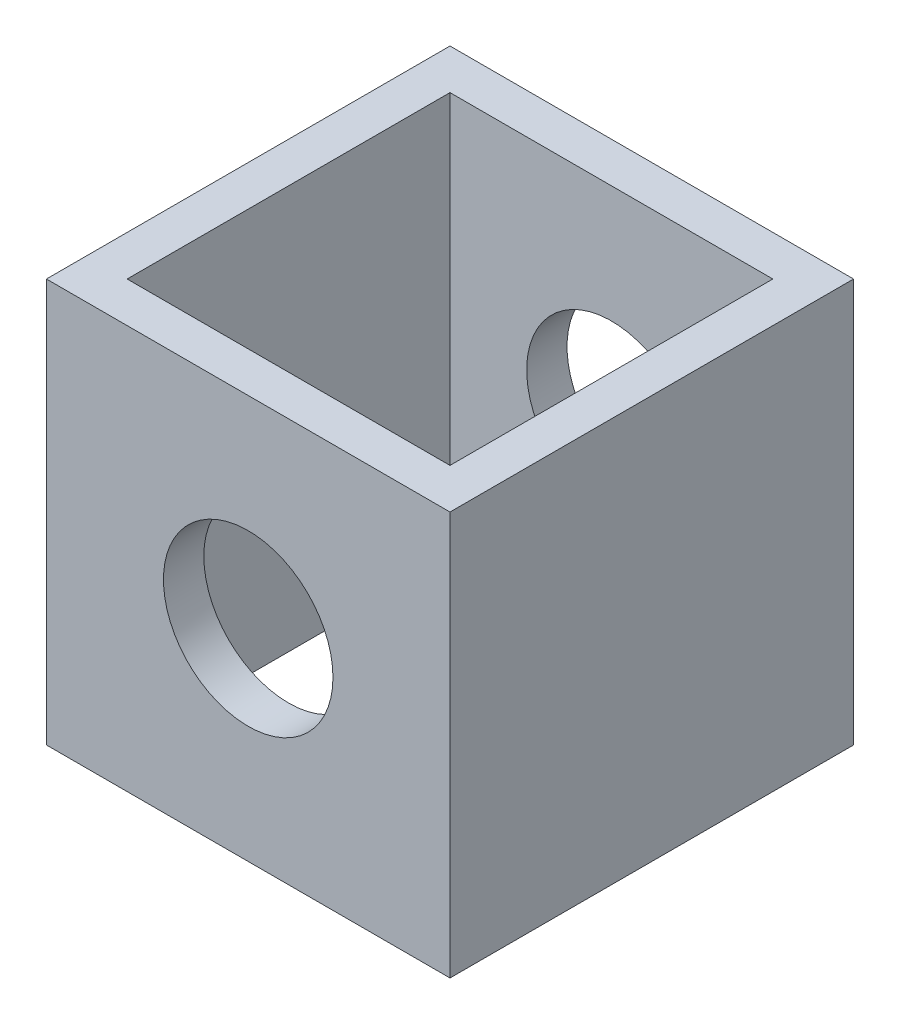
ISO-10303-21;
HEADER;
FILE_DESCRIPTION(('STEP AP214'),'2;1');
FILE_NAME('part.step','',(''),(''),'','','');
FILE_SCHEMA(('AUTOMOTIVE_DESIGN { 1 0 10303 214 1 1 1 1 }'));
ENDSEC;
DATA;
#1=APPLICATION_CONTEXT('core data for automotive mechanical design processes');
#2=APPLICATION_PROTOCOL_DEFINITION('international standard','automotive_design',2000,#1);
#3=PRODUCT_CONTEXT('',#1,'mechanical');
#4=PRODUCT('Part','Part','',(#3));
#5=PRODUCT_RELATED_PRODUCT_CATEGORY('part','',(#4));
#6=PRODUCT_DEFINITION_FORMATION('','',#4);
#7=PRODUCT_DEFINITION_CONTEXT('part definition',#1,'design');
#8=PRODUCT_DEFINITION('design','',#6,#7);
#9=PRODUCT_DEFINITION_SHAPE('','',#8);
#10=(LENGTH_UNIT() NAMED_UNIT(*) SI_UNIT(.MILLI.,.METRE.));
#11=(NAMED_UNIT(*) PLANE_ANGLE_UNIT() SI_UNIT($,.RADIAN.));
#12=(NAMED_UNIT(*) SI_UNIT($,.STERADIAN.) SOLID_ANGLE_UNIT());
#13=UNCERTAINTY_MEASURE_WITH_UNIT(LENGTH_MEASURE(1.E-05),#10,'distance_accuracy_value','');
#14=(GEOMETRIC_REPRESENTATION_CONTEXT(3) GLOBAL_UNCERTAINTY_ASSIGNED_CONTEXT((#13)) GLOBAL_UNIT_ASSIGNED_CONTEXT((#10,
#11,#12)) REPRESENTATION_CONTEXT('',''));
#15=CARTESIAN_POINT('',(0.,0.,0.));
#16=DIRECTION('',(0.,0.,1.));
#17=DIRECTION('',(1.,0.,0.));
#18=AXIS2_PLACEMENT_3D('',#15,#16,#17);
#19=CARTESIAN_POINT('',(0.,10.,0.));
#20=DIRECTION('',(0.,1.,0.));
#21=DIRECTION('',(0.,0.,1.));
#22=AXIS2_PLACEMENT_3D('',#19,#20,#21);
#23=PLANE('',#22);
#24=DIRECTION('',(0.,0.,-1.));
#25=VECTOR('',#24,1.);
#26=CARTESIAN_POINT('',(5.,10.,-5.));
#27=LINE('',#26,#25);
#28=CARTESIAN_POINT('',(5.,10.,5.));
#29=VERTEX_POINT('',#28);
#30=CARTESIAN_POINT('',(5.,10.,-5.));
#31=VERTEX_POINT('',#30);
#32=EDGE_CURVE('E163',#29,#31,#27,.T.);
#33=ORIENTED_EDGE('',*,*,#32,.T.);
#34=DIRECTION('',(-1.,0.,0.));
#35=VECTOR('',#34,1.);
#36=CARTESIAN_POINT('',(-5.,10.,-5.));
#37=LINE('',#36,#35);
#38=CARTESIAN_POINT('',(-5.,10.,-5.));
#39=VERTEX_POINT('',#38);
#40=EDGE_CURVE('E166',#31,#39,#37,.T.);
#41=ORIENTED_EDGE('',*,*,#40,.T.);
#42=DIRECTION('',(0.,0.,1.));
#43=VECTOR('',#42,1.);
#44=CARTESIAN_POINT('',(-5.,10.,-5.));
#45=LINE('',#44,#43);
#46=CARTESIAN_POINT('',(-5.,10.,5.));
#47=VERTEX_POINT('',#46);
#48=EDGE_CURVE('E169',#39,#47,#45,.T.);
#49=ORIENTED_EDGE('',*,*,#48,.T.);
#50=DIRECTION('',(1.,0.,0.));
#51=VECTOR('',#50,1.);
#52=CARTESIAN_POINT('',(-5.,10.,5.));
#53=LINE('',#52,#51);
#54=EDGE_CURVE('E171',#47,#29,#53,.T.);
#55=ORIENTED_EDGE('',*,*,#54,.T.);
#56=EDGE_LOOP('',(#33,#41,#49,#55));
#57=FACE_BOUND('',#56,.T.);
#58=DIRECTION('',(-1.,0.,0.));
#59=VECTOR('',#58,1.);
#60=CARTESIAN_POINT('',(-5.,10.,-4.));
#61=LINE('',#60,#59);
#62=CARTESIAN_POINT('',(4.,10.,-4.));
#63=VERTEX_POINT('',#62);
#64=CARTESIAN_POINT('',(-4.,10.,-4.));
#65=VERTEX_POINT('',#64);
#66=EDGE_CURVE('E133',#63,#65,#61,.T.);
#67=ORIENTED_EDGE('',*,*,#66,.F.);
#68=DIRECTION('',(0.,0.,-1.));
#69=VECTOR('',#68,1.);
#70=CARTESIAN_POINT('',(4.,10.,-5.));
#71=LINE('',#70,#69);
#72=CARTESIAN_POINT('',(4.,10.,4.));
#73=VERTEX_POINT('',#72);
#74=EDGE_CURVE('E125',#73,#63,#71,.T.);
#75=ORIENTED_EDGE('',*,*,#74,.F.);
#76=DIRECTION('',(1.,0.,0.));
#77=VECTOR('',#76,1.);
#78=CARTESIAN_POINT('',(-5.,10.,4.));
#79=LINE('',#78,#77);
#80=CARTESIAN_POINT('',(-4.,10.,4.));
#81=VERTEX_POINT('',#80);
#82=EDGE_CURVE('E147',#81,#73,#79,.T.);
#83=ORIENTED_EDGE('',*,*,#82,.F.);
#84=DIRECTION('',(0.,0.,1.));
#85=VECTOR('',#84,1.);
#86=CARTESIAN_POINT('',(-4.,10.,-5.));
#87=LINE('',#86,#85);
#88=EDGE_CURVE('E145',#65,#81,#87,.T.);
#89=ORIENTED_EDGE('',*,*,#88,.F.);
#90=EDGE_LOOP('',(#67,#75,#83,#89));
#91=FACE_BOUND('',#90,.T.);
#92=ADVANCED_FACE('F59',(#57,#91),#23,.T.);
#93=CARTESIAN_POINT('',(0.,0.,0.));
#94=DIRECTION('',(0.,1.,0.));
#95=DIRECTION('',(0.,0.,1.));
#96=AXIS2_PLACEMENT_3D('',#93,#94,#95);
#97=PLANE('',#96);
#98=DIRECTION('',(0.,0.,-1.));
#99=VECTOR('',#98,1.);
#100=CARTESIAN_POINT('',(5.,0.,-5.));
#101=LINE('',#100,#99);
#102=CARTESIAN_POINT('',(5.,0.,5.));
#103=VERTEX_POINT('',#102);
#104=CARTESIAN_POINT('',(5.,0.,-5.));
#105=VERTEX_POINT('',#104);
#106=EDGE_CURVE('E141',#103,#105,#101,.T.);
#107=ORIENTED_EDGE('',*,*,#106,.F.);
#108=DIRECTION('',(1.,0.,0.));
#109=VECTOR('',#108,1.);
#110=CARTESIAN_POINT('',(-5.,0.,5.));
#111=LINE('',#110,#109);
#112=CARTESIAN_POINT('',(-5.,0.,5.));
#113=VERTEX_POINT('',#112);
#114=EDGE_CURVE('E167',#113,#103,#111,.T.);
#115=ORIENTED_EDGE('',*,*,#114,.F.);
#116=DIRECTION('',(0.,0.,1.));
#117=VECTOR('',#116,1.);
#118=CARTESIAN_POINT('',(-5.,0.,-5.));
#119=LINE('',#118,#117);
#120=CARTESIAN_POINT('',(-5.,0.,-5.));
#121=VERTEX_POINT('',#120);
#122=EDGE_CURVE('E178',#121,#113,#119,.T.);
#123=ORIENTED_EDGE('',*,*,#122,.F.);
#124=DIRECTION('',(-1.,0.,0.));
#125=VECTOR('',#124,1.);
#126=CARTESIAN_POINT('',(-5.,0.,-5.));
#127=LINE('',#126,#125);
#128=EDGE_CURVE('E176',#105,#121,#127,.T.);
#129=ORIENTED_EDGE('',*,*,#128,.F.);
#130=EDGE_LOOP('',(#107,#115,#123,#129));
#131=FACE_BOUND('',#130,.T.);
#132=DIRECTION('',(0.,0.,-1.));
#133=VECTOR('',#132,1.);
#134=CARTESIAN_POINT('',(4.,0.,-5.));
#135=LINE('',#134,#133);
#136=CARTESIAN_POINT('',(4.,0.,4.));
#137=VERTEX_POINT('',#136);
#138=CARTESIAN_POINT('',(4.,0.,-4.));
#139=VERTEX_POINT('',#138);
#140=EDGE_CURVE('E83',#137,#139,#135,.T.);
#141=ORIENTED_EDGE('',*,*,#140,.T.);
#142=DIRECTION('',(-1.,0.,0.));
#143=VECTOR('',#142,1.);
#144=CARTESIAN_POINT('',(-5.,0.,-4.));
#145=LINE('',#144,#143);
#146=CARTESIAN_POINT('',(-4.,0.,-4.));
#147=VERTEX_POINT('',#146);
#148=EDGE_CURVE('E140',#139,#147,#145,.T.);
#149=ORIENTED_EDGE('',*,*,#148,.T.);
#150=DIRECTION('',(0.,0.,1.));
#151=VECTOR('',#150,1.);
#152=CARTESIAN_POINT('',(-4.,0.,-5.));
#153=LINE('',#152,#151);
#154=CARTESIAN_POINT('',(-4.,0.,4.));
#155=VERTEX_POINT('',#154);
#156=EDGE_CURVE('E155',#147,#155,#153,.T.);
#157=ORIENTED_EDGE('',*,*,#156,.T.);
#158=DIRECTION('',(1.,0.,0.));
#159=VECTOR('',#158,1.);
#160=CARTESIAN_POINT('',(-5.,0.,4.));
#161=LINE('',#160,#159);
#162=EDGE_CURVE('E134',#155,#137,#161,.T.);
#163=ORIENTED_EDGE('',*,*,#162,.T.);
#164=EDGE_LOOP('',(#141,#149,#157,#163));
#165=FACE_BOUND('',#164,.T.);
#166=ADVANCED_FACE('F197',(#131,#165),#97,.F.);
#167=CARTESIAN_POINT('',(5.,10.,-5.));
#168=DIRECTION('',(-1.,0.,0.));
#169=DIRECTION('',(0.,0.,1.));
#170=AXIS2_PLACEMENT_3D('',#167,#168,#169);
#171=PLANE('',#170);
#172=ORIENTED_EDGE('',*,*,#106,.T.);
#173=DIRECTION('',(0.,-1.,0.));
#174=VECTOR('',#173,1.);
#175=CARTESIAN_POINT('',(5.,10.,-5.));
#176=LINE('',#175,#174);
#177=EDGE_CURVE('E12',#31,#105,#176,.T.);
#178=ORIENTED_EDGE('',*,*,#177,.F.);
#179=ORIENTED_EDGE('',*,*,#32,.F.);
#180=DIRECTION('',(0.,-1.,0.));
#181=VECTOR('',#180,1.);
#182=CARTESIAN_POINT('',(5.,10.,5.));
#183=LINE('',#182,#181);
#184=EDGE_CURVE('E173',#29,#103,#183,.T.);
#185=ORIENTED_EDGE('',*,*,#184,.T.);
#186=EDGE_LOOP('',(#172,#178,#179,#185));
#187=FACE_BOUND('',#186,.T.);
#188=ADVANCED_FACE('F61',(#187),#171,.F.);
#189=CARTESIAN_POINT('',(-5.,10.,-5.));
#190=DIRECTION('',(0.,0.,1.));
#191=DIRECTION('',(1.,0.,0.));
#192=AXIS2_PLACEMENT_3D('',#189,#190,#191);
#193=PLANE('',#192);
#194=CARTESIAN_POINT('',(0.,5.,-5.));
#195=DIRECTION('',(0.,0.,1.));
#196=DIRECTION('',(1.,0.,0.));
#197=AXIS2_PLACEMENT_3D('',#194,#195,#196);
#198=CIRCLE('',#197,2.1);
#199=CARTESIAN_POINT('',(2.1,5.,-5.));
#200=VERTEX_POINT('',#199);
#201=EDGE_CURVE('E234',#200,#200,#198,.T.);
#202=ORIENTED_EDGE('',*,*,#201,.T.);
#203=EDGE_LOOP('',(#202));
#204=FACE_BOUND('',#203,.T.);
#205=ORIENTED_EDGE('',*,*,#128,.T.);
#206=DIRECTION('',(0.,-1.,0.));
#207=VECTOR('',#206,1.);
#208=CARTESIAN_POINT('',(-5.,10.,-5.));
#209=LINE('',#208,#207);
#210=EDGE_CURVE('E68',#39,#121,#209,.T.);
#211=ORIENTED_EDGE('',*,*,#210,.F.);
#212=ORIENTED_EDGE('',*,*,#40,.F.);
#213=ORIENTED_EDGE('',*,*,#177,.T.);
#214=EDGE_LOOP('',(#205,#211,#212,#213));
#215=FACE_BOUND('',#214,.T.);
#216=ADVANCED_FACE('F207',(#204,#215),#193,.F.);
#217=CARTESIAN_POINT('',(-5.,10.,-5.));
#218=DIRECTION('',(1.,0.,0.));
#219=DIRECTION('',(0.,0.,-1.));
#220=AXIS2_PLACEMENT_3D('',#217,#218,#219);
#221=PLANE('',#220);
#222=ORIENTED_EDGE('',*,*,#122,.T.);
#223=DIRECTION('',(0.,-1.,0.));
#224=VECTOR('',#223,1.);
#225=CARTESIAN_POINT('',(-5.,10.,5.));
#226=LINE('',#225,#224);
#227=EDGE_CURVE('E183',#47,#113,#226,.T.);
#228=ORIENTED_EDGE('',*,*,#227,.F.);
#229=ORIENTED_EDGE('',*,*,#48,.F.);
#230=ORIENTED_EDGE('',*,*,#210,.T.);
#231=EDGE_LOOP('',(#222,#228,#229,#230));
#232=FACE_BOUND('',#231,.T.);
#233=ADVANCED_FACE('F191',(#232),#221,.F.);
#234=CARTESIAN_POINT('',(-5.,10.,5.));
#235=DIRECTION('',(0.,0.,-1.));
#236=DIRECTION('',(-1.,0.,0.));
#237=AXIS2_PLACEMENT_3D('',#234,#235,#236);
#238=PLANE('',#237);
#239=CARTESIAN_POINT('',(0.,5.,5.));
#240=DIRECTION('',(0.,0.,1.));
#241=DIRECTION('',(1.,0.,0.));
#242=AXIS2_PLACEMENT_3D('',#239,#240,#241);
#243=CIRCLE('',#242,2.1);
#244=CARTESIAN_POINT('',(2.1,5.,5.));
#245=VERTEX_POINT('',#244);
#246=EDGE_CURVE('E232',#245,#245,#243,.T.);
#247=ORIENTED_EDGE('',*,*,#246,.F.);
#248=EDGE_LOOP('',(#247));
#249=FACE_BOUND('',#248,.T.);
#250=ORIENTED_EDGE('',*,*,#114,.T.);
#251=ORIENTED_EDGE('',*,*,#184,.F.);
#252=ORIENTED_EDGE('',*,*,#54,.F.);
#253=ORIENTED_EDGE('',*,*,#227,.T.);
#254=EDGE_LOOP('',(#250,#251,#252,#253));
#255=FACE_BOUND('',#254,.T.);
#256=ADVANCED_FACE('F201',(#249,#255),#238,.F.);
#257=CARTESIAN_POINT('',(4.,10.,-5.));
#258=DIRECTION('',(-1.,0.,0.));
#259=DIRECTION('',(0.,0.,1.));
#260=AXIS2_PLACEMENT_3D('',#257,#258,#259);
#261=PLANE('',#260);
#262=ORIENTED_EDGE('',*,*,#140,.F.);
#263=DIRECTION('',(0.,-1.,0.));
#264=VECTOR('',#263,1.);
#265=CARTESIAN_POINT('',(4.,10.,4.));
#266=LINE('',#265,#264);
#267=EDGE_CURVE('E129',#73,#137,#266,.T.);
#268=ORIENTED_EDGE('',*,*,#267,.F.);
#269=ORIENTED_EDGE('',*,*,#74,.T.);
#270=DIRECTION('',(0.,-1.,0.));
#271=VECTOR('',#270,1.);
#272=CARTESIAN_POINT('',(4.,10.,-4.));
#273=LINE('',#272,#271);
#274=EDGE_CURVE('E128',#63,#139,#273,.T.);
#275=ORIENTED_EDGE('',*,*,#274,.T.);
#276=EDGE_LOOP('',(#262,#268,#269,#275));
#277=FACE_BOUND('',#276,.T.);
#278=ADVANCED_FACE('F127',(#277),#261,.T.);
#279=CARTESIAN_POINT('',(-5.,10.,-4.));
#280=DIRECTION('',(0.,0.,1.));
#281=DIRECTION('',(1.,0.,0.));
#282=AXIS2_PLACEMENT_3D('',#279,#280,#281);
#283=PLANE('',#282);
#284=CARTESIAN_POINT('',(0.,5.,-4.));
#285=DIRECTION('',(0.,0.,1.));
#286=DIRECTION('',(1.,0.,0.));
#287=AXIS2_PLACEMENT_3D('',#284,#285,#286);
#288=CIRCLE('',#287,2.1);
#289=CARTESIAN_POINT('',(2.1,5.,-4.));
#290=VERTEX_POINT('',#289);
#291=EDGE_CURVE('E153',#290,#290,#288,.T.);
#292=ORIENTED_EDGE('',*,*,#291,.F.);
#293=EDGE_LOOP('',(#292));
#294=FACE_BOUND('',#293,.T.);
#295=ORIENTED_EDGE('',*,*,#148,.F.);
#296=ORIENTED_EDGE('',*,*,#274,.F.);
#297=ORIENTED_EDGE('',*,*,#66,.T.);
#298=DIRECTION('',(0.,-1.,0.));
#299=VECTOR('',#298,1.);
#300=CARTESIAN_POINT('',(-4.,10.,-4.));
#301=LINE('',#300,#299);
#302=EDGE_CURVE('E142',#65,#147,#301,.T.);
#303=ORIENTED_EDGE('',*,*,#302,.T.);
#304=EDGE_LOOP('',(#295,#296,#297,#303));
#305=FACE_BOUND('',#304,.T.);
#306=ADVANCED_FACE('F137',(#294,#305),#283,.T.);
#307=CARTESIAN_POINT('',(-4.,10.,-5.));
#308=DIRECTION('',(1.,0.,0.));
#309=DIRECTION('',(0.,0.,-1.));
#310=AXIS2_PLACEMENT_3D('',#307,#308,#309);
#311=PLANE('',#310);
#312=ORIENTED_EDGE('',*,*,#156,.F.);
#313=ORIENTED_EDGE('',*,*,#302,.F.);
#314=ORIENTED_EDGE('',*,*,#88,.T.);
#315=DIRECTION('',(0.,-1.,0.));
#316=VECTOR('',#315,1.);
#317=CARTESIAN_POINT('',(-4.,10.,4.));
#318=LINE('',#317,#316);
#319=EDGE_CURVE('E75',#81,#155,#318,.T.);
#320=ORIENTED_EDGE('',*,*,#319,.T.);
#321=EDGE_LOOP('',(#312,#313,#314,#320));
#322=FACE_BOUND('',#321,.T.);
#323=ADVANCED_FACE('F247',(#322),#311,.T.);
#324=CARTESIAN_POINT('',(-5.,10.,4.));
#325=DIRECTION('',(0.,0.,-1.));
#326=DIRECTION('',(-1.,0.,0.));
#327=AXIS2_PLACEMENT_3D('',#324,#325,#326);
#328=PLANE('',#327);
#329=CARTESIAN_POINT('',(0.,5.,4.));
#330=DIRECTION('',(0.,0.,-1.));
#331=DIRECTION('',(-1.,0.,0.));
#332=AXIS2_PLACEMENT_3D('',#329,#330,#331);
#333=CIRCLE('',#332,2.1);
#334=CARTESIAN_POINT('',(-2.1,5.,4.));
#335=VERTEX_POINT('',#334);
#336=EDGE_CURVE('E63',#335,#335,#333,.T.);
#337=ORIENTED_EDGE('',*,*,#336,.F.);
#338=EDGE_LOOP('',(#337));
#339=FACE_BOUND('',#338,.T.);
#340=ORIENTED_EDGE('',*,*,#162,.F.);
#341=ORIENTED_EDGE('',*,*,#319,.F.);
#342=ORIENTED_EDGE('',*,*,#82,.T.);
#343=ORIENTED_EDGE('',*,*,#267,.T.);
#344=EDGE_LOOP('',(#340,#341,#342,#343));
#345=FACE_BOUND('',#344,.T.);
#346=ADVANCED_FACE('F245',(#339,#345),#328,.T.);
#347=CARTESIAN_POINT('',(0.,5.,-5.));
#348=DIRECTION('',(0.,0.,1.));
#349=DIRECTION('',(1.,0.,0.));
#350=AXIS2_PLACEMENT_3D('',#347,#348,#349);
#351=CYLINDRICAL_SURFACE('',#350,2.1);
#352=ORIENTED_EDGE('',*,*,#336,.T.);
#353=EDGE_LOOP('',(#352));
#354=FACE_BOUND('',#353,.T.);
#355=ORIENTED_EDGE('',*,*,#246,.T.);
#356=EDGE_LOOP('',(#355));
#357=FACE_BOUND('',#356,.T.);
#358=ADVANCED_FACE('F243',(#354,#357),#351,.F.);
#359=ORIENTED_EDGE('',*,*,#291,.T.);
#360=EDGE_LOOP('',(#359));
#361=FACE_BOUND('',#360,.T.);
#362=ORIENTED_EDGE('',*,*,#201,.F.);
#363=EDGE_LOOP('',(#362));
#364=FACE_BOUND('',#363,.T.);
#365=ADVANCED_FACE('F259',(#361,#364),#351,.F.);
#366=CLOSED_SHELL('',(#92,#166,#188,#216,#233,#256,#278,#306,#323,#346,#358,#365));
#367=MANIFOLD_SOLID_BREP('B2',#366);
#368=ADVANCED_BREP_SHAPE_REPRESENTATION('',(#18,#367),#14);
#369=SHAPE_DEFINITION_REPRESENTATION(#9,#368);
ENDSEC;
END-ISO-10303-21;
